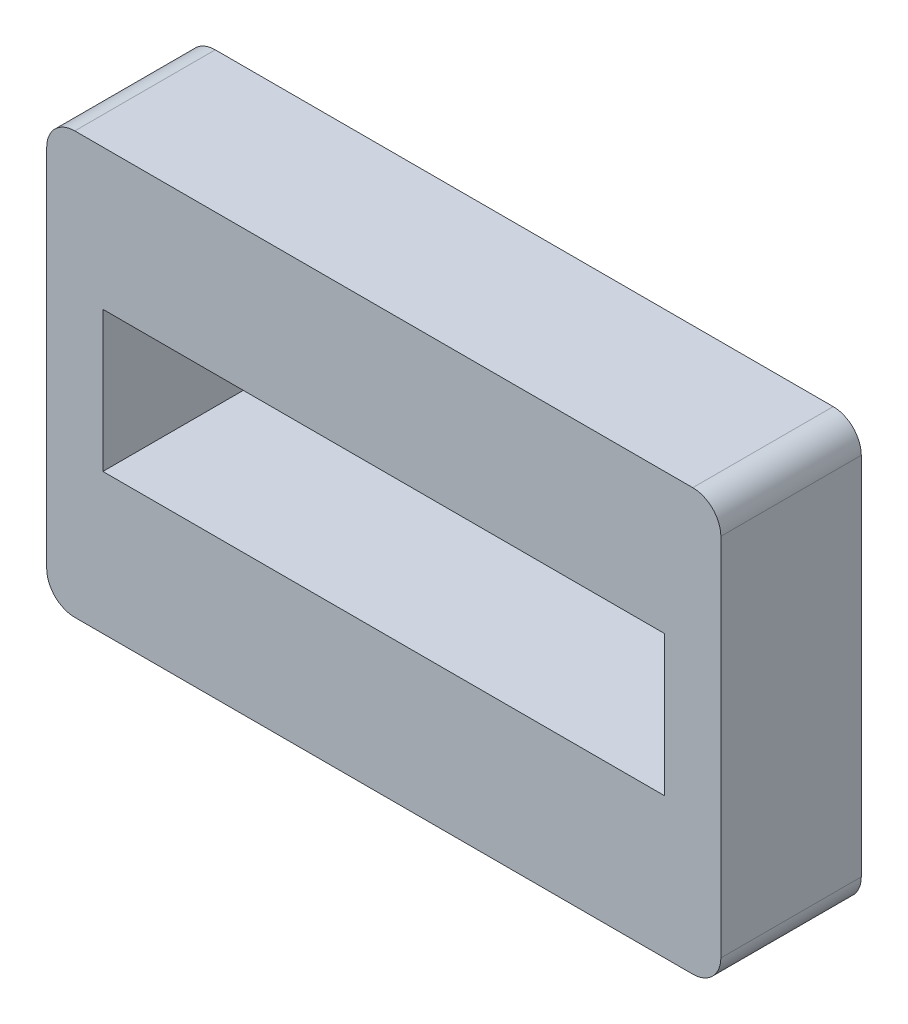
ISO-10303-21;
HEADER;
FILE_DESCRIPTION(('STEP AP214'),'2;1');
FILE_NAME('part.step','',(''),(''),'','','');
FILE_SCHEMA(('AUTOMOTIVE_DESIGN { 1 0 10303 214 1 1 1 1 }'));
ENDSEC;
DATA;
#1=APPLICATION_CONTEXT('core data for automotive mechanical design processes');
#2=APPLICATION_PROTOCOL_DEFINITION('international standard','automotive_design',2000,#1);
#3=PRODUCT_CONTEXT('',#1,'mechanical');
#4=PRODUCT('Part','Part','',(#3));
#5=PRODUCT_RELATED_PRODUCT_CATEGORY('part','',(#4));
#6=PRODUCT_DEFINITION_FORMATION('','',#4);
#7=PRODUCT_DEFINITION_CONTEXT('part definition',#1,'design');
#8=PRODUCT_DEFINITION('design','',#6,#7);
#9=PRODUCT_DEFINITION_SHAPE('','',#8);
#10=(LENGTH_UNIT() NAMED_UNIT(*) SI_UNIT(.MILLI.,.METRE.));
#11=(NAMED_UNIT(*) PLANE_ANGLE_UNIT() SI_UNIT($,.RADIAN.));
#12=(NAMED_UNIT(*) SI_UNIT($,.STERADIAN.) SOLID_ANGLE_UNIT());
#13=UNCERTAINTY_MEASURE_WITH_UNIT(LENGTH_MEASURE(1.E-05),#10,'distance_accuracy_value','');
#14=(GEOMETRIC_REPRESENTATION_CONTEXT(3) GLOBAL_UNCERTAINTY_ASSIGNED_CONTEXT((#13)) GLOBAL_UNIT_ASSIGNED_CONTEXT((#10,
#11,#12)) REPRESENTATION_CONTEXT('',''));
#15=CARTESIAN_POINT('',(0.,0.,0.));
#16=DIRECTION('',(0.,0.,1.));
#17=DIRECTION('',(1.,0.,0.));
#18=AXIS2_PLACEMENT_3D('',#15,#16,#17);
#19=CARTESIAN_POINT('',(-12.,15.,-2.5));
#20=DIRECTION('',(1.,0.,0.));
#21=DIRECTION('',(0.,0.,-1.));
#22=AXIS2_PLACEMENT_3D('',#19,#20,#21);
#23=PLANE('',#22);
#24=DIRECTION('',(0.,-1.,0.));
#25=VECTOR('',#24,1.);
#26=CARTESIAN_POINT('',(-12.,15.,-2.5));
#27=LINE('',#26,#25);
#28=CARTESIAN_POINT('',(-12.,14.,-2.5));
#29=VERTEX_POINT('',#28);
#30=CARTESIAN_POINT('',(-12.,1.,-2.5));
#31=VERTEX_POINT('',#30);
#32=EDGE_CURVE('E196',#29,#31,#27,.T.);
#33=ORIENTED_EDGE('',*,*,#32,.T.);
#34=DIRECTION('',(0.,0.,1.));
#35=VECTOR('',#34,1.);
#36=CARTESIAN_POINT('',(-12.,1.,-2.5));
#37=LINE('',#36,#35);
#38=CARTESIAN_POINT('',(-12.,1.,2.5));
#39=VERTEX_POINT('',#38);
#40=EDGE_CURVE('E255',#31,#39,#37,.T.);
#41=ORIENTED_EDGE('',*,*,#40,.T.);
#42=DIRECTION('',(0.,-1.,0.));
#43=VECTOR('',#42,1.);
#44=CARTESIAN_POINT('',(-12.,15.,2.5));
#45=LINE('',#44,#43);
#46=CARTESIAN_POINT('',(-12.,14.,2.5));
#47=VERTEX_POINT('',#46);
#48=EDGE_CURVE('E214',#47,#39,#45,.T.);
#49=ORIENTED_EDGE('',*,*,#48,.F.);
#50=DIRECTION('',(0.,0.,1.));
#51=VECTOR('',#50,1.);
#52=CARTESIAN_POINT('',(-12.,14.,-2.5));
#53=LINE('',#52,#51);
#54=EDGE_CURVE('E252',#47,#29,#53,.F.);
#55=ORIENTED_EDGE('',*,*,#54,.T.);
#56=EDGE_LOOP('',(#33,#41,#49,#55));
#57=FACE_BOUND('',#56,.T.);
#58=ADVANCED_FACE('F39',(#57),#23,.F.);
#59=CARTESIAN_POINT('',(-12.,15.,2.5));
#60=DIRECTION('',(0.,0.,-1.));
#61=DIRECTION('',(-1.,0.,0.));
#62=AXIS2_PLACEMENT_3D('',#59,#60,#61);
#63=PLANE('',#62);
#64=DIRECTION('',(1.,0.,0.));
#65=VECTOR('',#64,1.);
#66=CARTESIAN_POINT('',(-12.,10.,2.5));
#67=LINE('',#66,#65);
#68=CARTESIAN_POINT('',(-10.,10.,2.5));
#69=VERTEX_POINT('',#68);
#70=CARTESIAN_POINT('',(10.,10.,2.5));
#71=VERTEX_POINT('',#70);
#72=EDGE_CURVE('E178',#69,#71,#67,.T.);
#73=ORIENTED_EDGE('',*,*,#72,.T.);
#74=DIRECTION('',(0.,-1.,0.));
#75=VECTOR('',#74,1.);
#76=CARTESIAN_POINT('',(10.,15.,2.5));
#77=LINE('',#76,#75);
#78=CARTESIAN_POINT('',(10.,5.,2.5));
#79=VERTEX_POINT('',#78);
#80=EDGE_CURVE('E182',#71,#79,#77,.T.);
#81=ORIENTED_EDGE('',*,*,#80,.T.);
#82=DIRECTION('',(-1.,0.,0.));
#83=VECTOR('',#82,1.);
#84=CARTESIAN_POINT('',(-12.,5.,2.5));
#85=LINE('',#84,#83);
#86=CARTESIAN_POINT('',(-10.,5.,2.5));
#87=VERTEX_POINT('',#86);
#88=EDGE_CURVE('E169',#79,#87,#85,.T.);
#89=ORIENTED_EDGE('',*,*,#88,.T.);
#90=DIRECTION('',(0.,1.,0.));
#91=VECTOR('',#90,1.);
#92=CARTESIAN_POINT('',(-9.99999999999999,15.,2.5));
#93=LINE('',#92,#91);
#94=EDGE_CURVE('E139',#87,#69,#93,.T.);
#95=ORIENTED_EDGE('',*,*,#94,.T.);
#96=EDGE_LOOP('',(#73,#81,#89,#95));
#97=FACE_BOUND('',#96,.T.);
#98=DIRECTION('',(1.,0.,0.));
#99=VECTOR('',#98,1.);
#100=CARTESIAN_POINT('',(-12.,0.,2.5));
#101=LINE('',#100,#99);
#102=CARTESIAN_POINT('',(-11.,0.,2.5));
#103=VERTEX_POINT('',#102);
#104=CARTESIAN_POINT('',(11.,0.,2.5));
#105=VERTEX_POINT('',#104);
#106=EDGE_CURVE('E186',#103,#105,#101,.T.);
#107=ORIENTED_EDGE('',*,*,#106,.T.);
#108=CARTESIAN_POINT('',(11.,1.,2.5));
#109=DIRECTION('',(0.,0.,-1.));
#110=DIRECTION('',(-1.,0.,0.));
#111=AXIS2_PLACEMENT_3D('',#108,#109,#110);
#112=CIRCLE('',#111,1.);
#113=CARTESIAN_POINT('',(12.,1.,2.5));
#114=VERTEX_POINT('',#113);
#115=EDGE_CURVE('E249',#105,#114,#112,.F.);
#116=ORIENTED_EDGE('',*,*,#115,.T.);
#117=DIRECTION('',(0.,-1.,0.));
#118=VECTOR('',#117,1.);
#119=CARTESIAN_POINT('',(12.,15.,2.5));
#120=LINE('',#119,#118);
#121=CARTESIAN_POINT('',(12.,14.,2.5));
#122=VERTEX_POINT('',#121);
#123=EDGE_CURVE('E210',#122,#114,#120,.T.);
#124=ORIENTED_EDGE('',*,*,#123,.F.);
#125=CARTESIAN_POINT('',(11.,14.,2.5));
#126=DIRECTION('',(0.,0.,-1.));
#127=DIRECTION('',(-1.,0.,0.));
#128=AXIS2_PLACEMENT_3D('',#125,#126,#127);
#129=CIRCLE('',#128,1.);
#130=CARTESIAN_POINT('',(11.,15.,2.5));
#131=VERTEX_POINT('',#130);
#132=EDGE_CURVE('E242',#122,#131,#129,.F.);
#133=ORIENTED_EDGE('',*,*,#132,.T.);
#134=DIRECTION('',(1.,0.,0.));
#135=VECTOR('',#134,1.);
#136=CARTESIAN_POINT('',(-12.,15.,2.5));
#137=LINE('',#136,#135);
#138=CARTESIAN_POINT('',(-11.,15.,2.5));
#139=VERTEX_POINT('',#138);
#140=EDGE_CURVE('E187',#139,#131,#137,.T.);
#141=ORIENTED_EDGE('',*,*,#140,.F.);
#142=CARTESIAN_POINT('',(-11.,14.,2.5));
#143=DIRECTION('',(0.,0.,-1.));
#144=DIRECTION('',(-1.,0.,0.));
#145=AXIS2_PLACEMENT_3D('',#142,#143,#144);
#146=CIRCLE('',#145,1.);
#147=EDGE_CURVE('E63',#139,#47,#146,.F.);
#148=ORIENTED_EDGE('',*,*,#147,.T.);
#149=ORIENTED_EDGE('',*,*,#48,.T.);
#150=CARTESIAN_POINT('',(-11.,1.,2.5));
#151=DIRECTION('',(0.,0.,-1.));
#152=DIRECTION('',(-1.,0.,0.));
#153=AXIS2_PLACEMENT_3D('',#150,#151,#152);
#154=CIRCLE('',#153,1.);
#155=EDGE_CURVE('E55',#39,#103,#154,.F.);
#156=ORIENTED_EDGE('',*,*,#155,.T.);
#157=EDGE_LOOP('',(#107,#116,#124,#133,#141,#148,#149,#156));
#158=FACE_BOUND('',#157,.T.);
#159=ADVANCED_FACE('F272',(#97,#158),#63,.F.);
#160=CARTESIAN_POINT('',(12.,15.,-2.5));
#161=DIRECTION('',(-1.,0.,0.));
#162=DIRECTION('',(0.,0.,1.));
#163=AXIS2_PLACEMENT_3D('',#160,#161,#162);
#164=PLANE('',#163);
#165=ORIENTED_EDGE('',*,*,#123,.T.);
#166=DIRECTION('',(0.,0.,-1.));
#167=VECTOR('',#166,1.);
#168=CARTESIAN_POINT('',(12.,1.,-2.5));
#169=LINE('',#168,#167);
#170=CARTESIAN_POINT('',(12.,1.,-2.5));
#171=VERTEX_POINT('',#170);
#172=EDGE_CURVE('E220',#114,#171,#169,.T.);
#173=ORIENTED_EDGE('',*,*,#172,.T.);
#174=DIRECTION('',(0.,-1.,0.));
#175=VECTOR('',#174,1.);
#176=CARTESIAN_POINT('',(12.,15.,-2.5));
#177=LINE('',#176,#175);
#178=CARTESIAN_POINT('',(12.,14.,-2.5));
#179=VERTEX_POINT('',#178);
#180=EDGE_CURVE('E206',#179,#171,#177,.T.);
#181=ORIENTED_EDGE('',*,*,#180,.F.);
#182=DIRECTION('',(0.,0.,-1.));
#183=VECTOR('',#182,1.);
#184=CARTESIAN_POINT('',(12.,14.,2.5));
#185=LINE('',#184,#183);
#186=EDGE_CURVE('E217',#179,#122,#185,.F.);
#187=ORIENTED_EDGE('',*,*,#186,.T.);
#188=EDGE_LOOP('',(#165,#173,#181,#187));
#189=FACE_BOUND('',#188,.T.);
#190=ADVANCED_FACE('F276',(#189),#164,.F.);
#191=CARTESIAN_POINT('',(-12.,15.,-2.5));
#192=DIRECTION('',(0.,0.,1.));
#193=DIRECTION('',(1.,0.,0.));
#194=AXIS2_PLACEMENT_3D('',#191,#192,#193);
#195=PLANE('',#194);
#196=DIRECTION('',(-1.,0.,0.));
#197=VECTOR('',#196,1.);
#198=CARTESIAN_POINT('',(10.,5.,-2.5));
#199=LINE('',#198,#197);
#200=CARTESIAN_POINT('',(10.,5.,-2.5));
#201=VERTEX_POINT('',#200);
#202=CARTESIAN_POINT('',(-10.,5.,-2.5));
#203=VERTEX_POINT('',#202);
#204=EDGE_CURVE('E148',#201,#203,#199,.T.);
#205=ORIENTED_EDGE('',*,*,#204,.F.);
#206=DIRECTION('',(0.,-1.,0.));
#207=VECTOR('',#206,1.);
#208=CARTESIAN_POINT('',(10.,10.,-2.5));
#209=LINE('',#208,#207);
#210=CARTESIAN_POINT('',(10.,10.,-2.5));
#211=VERTEX_POINT('',#210);
#212=EDGE_CURVE('E154',#211,#201,#209,.T.);
#213=ORIENTED_EDGE('',*,*,#212,.F.);
#214=DIRECTION('',(1.,0.,0.));
#215=VECTOR('',#214,1.);
#216=CARTESIAN_POINT('',(10.,10.,-2.5));
#217=LINE('',#216,#215);
#218=CARTESIAN_POINT('',(-10.,10.,-2.5));
#219=VERTEX_POINT('',#218);
#220=EDGE_CURVE('E159',#219,#211,#217,.T.);
#221=ORIENTED_EDGE('',*,*,#220,.F.);
#222=DIRECTION('',(0.,1.,0.));
#223=VECTOR('',#222,1.);
#224=CARTESIAN_POINT('',(-10.,10.,-2.5));
#225=LINE('',#224,#223);
#226=EDGE_CURVE('E136',#203,#219,#225,.T.);
#227=ORIENTED_EDGE('',*,*,#226,.F.);
#228=EDGE_LOOP('',(#205,#213,#221,#227));
#229=FACE_BOUND('',#228,.T.);
#230=ORIENTED_EDGE('',*,*,#180,.T.);
#231=CARTESIAN_POINT('',(11.,1.,-2.5));
#232=DIRECTION('',(0.,0.,1.));
#233=DIRECTION('',(1.,0.,0.));
#234=AXIS2_PLACEMENT_3D('',#231,#232,#233);
#235=CIRCLE('',#234,1.);
#236=CARTESIAN_POINT('',(11.,0.,-2.5));
#237=VERTEX_POINT('',#236);
#238=EDGE_CURVE('E233',#171,#237,#235,.F.);
#239=ORIENTED_EDGE('',*,*,#238,.T.);
#240=DIRECTION('',(-1.,0.,0.));
#241=VECTOR('',#240,1.);
#242=CARTESIAN_POINT('',(-12.,0.,-2.5));
#243=LINE('',#242,#241);
#244=CARTESIAN_POINT('',(-11.,0.,-2.5));
#245=VERTEX_POINT('',#244);
#246=EDGE_CURVE('E192',#237,#245,#243,.T.);
#247=ORIENTED_EDGE('',*,*,#246,.T.);
#248=CARTESIAN_POINT('',(-11.,1.,-2.5));
#249=DIRECTION('',(0.,0.,1.));
#250=DIRECTION('',(1.,0.,0.));
#251=AXIS2_PLACEMENT_3D('',#248,#249,#250);
#252=CIRCLE('',#251,1.);
#253=EDGE_CURVE('E230',#245,#31,#252,.F.);
#254=ORIENTED_EDGE('',*,*,#253,.T.);
#255=ORIENTED_EDGE('',*,*,#32,.F.);
#256=CARTESIAN_POINT('',(-11.,14.,-2.5));
#257=DIRECTION('',(0.,0.,1.));
#258=DIRECTION('',(1.,0.,0.));
#259=AXIS2_PLACEMENT_3D('',#256,#257,#258);
#260=CIRCLE('',#259,1.);
#261=CARTESIAN_POINT('',(-11.,15.,-2.5));
#262=VERTEX_POINT('',#261);
#263=EDGE_CURVE('E227',#29,#262,#260,.F.);
#264=ORIENTED_EDGE('',*,*,#263,.T.);
#265=DIRECTION('',(-1.,0.,0.));
#266=VECTOR('',#265,1.);
#267=CARTESIAN_POINT('',(-12.,15.,-2.5));
#268=LINE('',#267,#266);
#269=CARTESIAN_POINT('',(11.,15.,-2.5));
#270=VERTEX_POINT('',#269);
#271=EDGE_CURVE('E191',#270,#262,#268,.T.);
#272=ORIENTED_EDGE('',*,*,#271,.F.);
#273=CARTESIAN_POINT('',(11.,14.,-2.5));
#274=DIRECTION('',(0.,0.,1.));
#275=DIRECTION('',(1.,0.,0.));
#276=AXIS2_PLACEMENT_3D('',#273,#274,#275);
#277=CIRCLE('',#276,1.);
#278=EDGE_CURVE('E224',#270,#179,#277,.F.);
#279=ORIENTED_EDGE('',*,*,#278,.T.);
#280=EDGE_LOOP('',(#230,#239,#247,#254,#255,#264,#272,#279));
#281=FACE_BOUND('',#280,.T.);
#282=ADVANCED_FACE('F156',(#229,#281),#195,.F.);
#283=CARTESIAN_POINT('',(0.,15.,0.));
#284=DIRECTION('',(0.,1.,0.));
#285=DIRECTION('',(0.,0.,1.));
#286=AXIS2_PLACEMENT_3D('',#283,#284,#285);
#287=PLANE('',#286);
#288=ORIENTED_EDGE('',*,*,#271,.T.);
#289=DIRECTION('',(0.,0.,1.));
#290=VECTOR('',#289,1.);
#291=CARTESIAN_POINT('',(-11.,15.,2.5));
#292=LINE('',#291,#290);
#293=EDGE_CURVE('E11',#262,#139,#292,.T.);
#294=ORIENTED_EDGE('',*,*,#293,.T.);
#295=ORIENTED_EDGE('',*,*,#140,.T.);
#296=DIRECTION('',(0.,0.,-1.));
#297=VECTOR('',#296,1.);
#298=CARTESIAN_POINT('',(11.,15.,-2.5));
#299=LINE('',#298,#297);
#300=EDGE_CURVE('E48',#131,#270,#299,.T.);
#301=ORIENTED_EDGE('',*,*,#300,.T.);
#302=EDGE_LOOP('',(#288,#294,#295,#301));
#303=FACE_BOUND('',#302,.T.);
#304=ADVANCED_FACE('F262',(#303),#287,.T.);
#305=CARTESIAN_POINT('',(0.,0.,0.));
#306=DIRECTION('',(0.,1.,0.));
#307=DIRECTION('',(0.,0.,1.));
#308=AXIS2_PLACEMENT_3D('',#305,#306,#307);
#309=PLANE('',#308);
#310=ORIENTED_EDGE('',*,*,#246,.F.);
#311=DIRECTION('',(0.,0.,-1.));
#312=VECTOR('',#311,1.);
#313=CARTESIAN_POINT('',(11.,0.,0.));
#314=LINE('',#313,#312);
#315=EDGE_CURVE('E239',#237,#105,#314,.F.);
#316=ORIENTED_EDGE('',*,*,#315,.T.);
#317=ORIENTED_EDGE('',*,*,#106,.F.);
#318=DIRECTION('',(0.,0.,1.));
#319=VECTOR('',#318,1.);
#320=CARTESIAN_POINT('',(-11.,0.,0.));
#321=LINE('',#320,#319);
#322=EDGE_CURVE('E236',#103,#245,#321,.F.);
#323=ORIENTED_EDGE('',*,*,#322,.T.);
#324=EDGE_LOOP('',(#310,#316,#317,#323));
#325=FACE_BOUND('',#324,.T.);
#326=ADVANCED_FACE('F283',(#325),#309,.F.);
#327=CARTESIAN_POINT('',(10.,10.,12.5));
#328=DIRECTION('',(1.,0.,0.));
#329=DIRECTION('',(0.,1.,0.));
#330=AXIS2_PLACEMENT_3D('',#327,#328,#329);
#331=PLANE('',#330);
#332=DIRECTION('',(0.,0.,-1.));
#333=VECTOR('',#332,1.);
#334=CARTESIAN_POINT('',(10.,10.,12.5));
#335=LINE('',#334,#333);
#336=EDGE_CURVE('E166',#71,#211,#335,.T.);
#337=ORIENTED_EDGE('',*,*,#336,.T.);
#338=ORIENTED_EDGE('',*,*,#212,.T.);
#339=DIRECTION('',(0.,0.,-1.));
#340=VECTOR('',#339,1.);
#341=CARTESIAN_POINT('',(10.,5.,12.5));
#342=LINE('',#341,#340);
#343=EDGE_CURVE('E144',#79,#201,#342,.T.);
#344=ORIENTED_EDGE('',*,*,#343,.F.);
#345=ORIENTED_EDGE('',*,*,#80,.F.);
#346=EDGE_LOOP('',(#337,#338,#344,#345));
#347=FACE_BOUND('',#346,.T.);
#348=ADVANCED_FACE('F334',(#347),#331,.F.);
#349=CARTESIAN_POINT('',(10.,10.,12.5));
#350=DIRECTION('',(0.,1.,0.));
#351=DIRECTION('',(0.,0.,1.));
#352=AXIS2_PLACEMENT_3D('',#349,#350,#351);
#353=PLANE('',#352);
#354=DIRECTION('',(0.,0.,-1.));
#355=VECTOR('',#354,1.);
#356=CARTESIAN_POINT('',(-10.,10.,12.5));
#357=LINE('',#356,#355);
#358=EDGE_CURVE('E143',#69,#219,#357,.T.);
#359=ORIENTED_EDGE('',*,*,#358,.T.);
#360=ORIENTED_EDGE('',*,*,#220,.T.);
#361=ORIENTED_EDGE('',*,*,#336,.F.);
#362=ORIENTED_EDGE('',*,*,#72,.F.);
#363=EDGE_LOOP('',(#359,#360,#361,#362));
#364=FACE_BOUND('',#363,.T.);
#365=ADVANCED_FACE('F384',(#364),#353,.F.);
#366=CARTESIAN_POINT('',(-10.,10.,12.5));
#367=DIRECTION('',(-1.,0.,0.));
#368=DIRECTION('',(0.,-1.,0.));
#369=AXIS2_PLACEMENT_3D('',#366,#367,#368);
#370=PLANE('',#369);
#371=DIRECTION('',(0.,0.,-1.));
#372=VECTOR('',#371,1.);
#373=CARTESIAN_POINT('',(-10.,5.,12.5));
#374=LINE('',#373,#372);
#375=EDGE_CURVE('E131',#87,#203,#374,.T.);
#376=ORIENTED_EDGE('',*,*,#375,.T.);
#377=ORIENTED_EDGE('',*,*,#226,.T.);
#378=ORIENTED_EDGE('',*,*,#358,.F.);
#379=ORIENTED_EDGE('',*,*,#94,.F.);
#380=EDGE_LOOP('',(#376,#377,#378,#379));
#381=FACE_BOUND('',#380,.T.);
#382=ADVANCED_FACE('F133',(#381),#370,.F.);
#383=CARTESIAN_POINT('',(10.,5.,12.5));
#384=DIRECTION('',(0.,-1.,0.));
#385=DIRECTION('',(0.,0.,-1.));
#386=AXIS2_PLACEMENT_3D('',#383,#384,#385);
#387=PLANE('',#386);
#388=ORIENTED_EDGE('',*,*,#343,.T.);
#389=ORIENTED_EDGE('',*,*,#204,.T.);
#390=ORIENTED_EDGE('',*,*,#375,.F.);
#391=ORIENTED_EDGE('',*,*,#88,.F.);
#392=EDGE_LOOP('',(#388,#389,#390,#391));
#393=FACE_BOUND('',#392,.T.);
#394=ADVANCED_FACE('F149',(#393),#387,.F.);
#395=CARTESIAN_POINT('',(11.,1.,-2.5));
#396=DIRECTION('',(0.,0.,-1.));
#397=DIRECTION('',(-1.,0.,0.));
#398=AXIS2_PLACEMENT_3D('',#395,#396,#397);
#399=CYLINDRICAL_SURFACE('',#398,1.);
#400=ORIENTED_EDGE('',*,*,#115,.F.);
#401=ORIENTED_EDGE('',*,*,#315,.F.);
#402=ORIENTED_EDGE('',*,*,#238,.F.);
#403=ORIENTED_EDGE('',*,*,#172,.F.);
#404=EDGE_LOOP('',(#400,#401,#402,#403));
#405=FACE_BOUND('',#404,.T.);
#406=ADVANCED_FACE('F286',(#405),#399,.T.);
#407=CARTESIAN_POINT('',(-11.,1.,-2.5));
#408=DIRECTION('',(0.,0.,1.));
#409=DIRECTION('',(1.,0.,0.));
#410=AXIS2_PLACEMENT_3D('',#407,#408,#409);
#411=CYLINDRICAL_SURFACE('',#410,1.);
#412=ORIENTED_EDGE('',*,*,#253,.F.);
#413=ORIENTED_EDGE('',*,*,#322,.F.);
#414=ORIENTED_EDGE('',*,*,#155,.F.);
#415=ORIENTED_EDGE('',*,*,#40,.F.);
#416=EDGE_LOOP('',(#412,#413,#414,#415));
#417=FACE_BOUND('',#416,.T.);
#418=ADVANCED_FACE('F287',(#417),#411,.T.);
#419=CARTESIAN_POINT('',(-11.,14.,0.));
#420=DIRECTION('',(0.,0.,-1.));
#421=DIRECTION('',(-1.,0.,0.));
#422=AXIS2_PLACEMENT_3D('',#419,#420,#421);
#423=CYLINDRICAL_SURFACE('',#422,1.);
#424=ORIENTED_EDGE('',*,*,#263,.F.);
#425=ORIENTED_EDGE('',*,*,#54,.F.);
#426=ORIENTED_EDGE('',*,*,#147,.F.);
#427=ORIENTED_EDGE('',*,*,#293,.F.);
#428=EDGE_LOOP('',(#424,#425,#426,#427));
#429=FACE_BOUND('',#428,.T.);
#430=ADVANCED_FACE('F271',(#429),#423,.T.);
#431=CARTESIAN_POINT('',(11.,14.,0.));
#432=DIRECTION('',(0.,0.,1.));
#433=DIRECTION('',(1.,0.,0.));
#434=AXIS2_PLACEMENT_3D('',#431,#432,#433);
#435=CYLINDRICAL_SURFACE('',#434,1.);
#436=ORIENTED_EDGE('',*,*,#132,.F.);
#437=ORIENTED_EDGE('',*,*,#186,.F.);
#438=ORIENTED_EDGE('',*,*,#278,.F.);
#439=ORIENTED_EDGE('',*,*,#300,.F.);
#440=EDGE_LOOP('',(#436,#437,#438,#439));
#441=FACE_BOUND('',#440,.T.);
#442=ADVANCED_FACE('F41',(#441),#435,.T.);
#443=CLOSED_SHELL('',(#58,#159,#190,#282,#304,#326,#348,#365,#382,#394,#406,#418,#430,#442));
#444=MANIFOLD_SOLID_BREP('B2',#443);
#445=ADVANCED_BREP_SHAPE_REPRESENTATION('',(#18,#444),#14);
#446=SHAPE_DEFINITION_REPRESENTATION(#9,#445);
ENDSEC;
END-ISO-10303-21;
